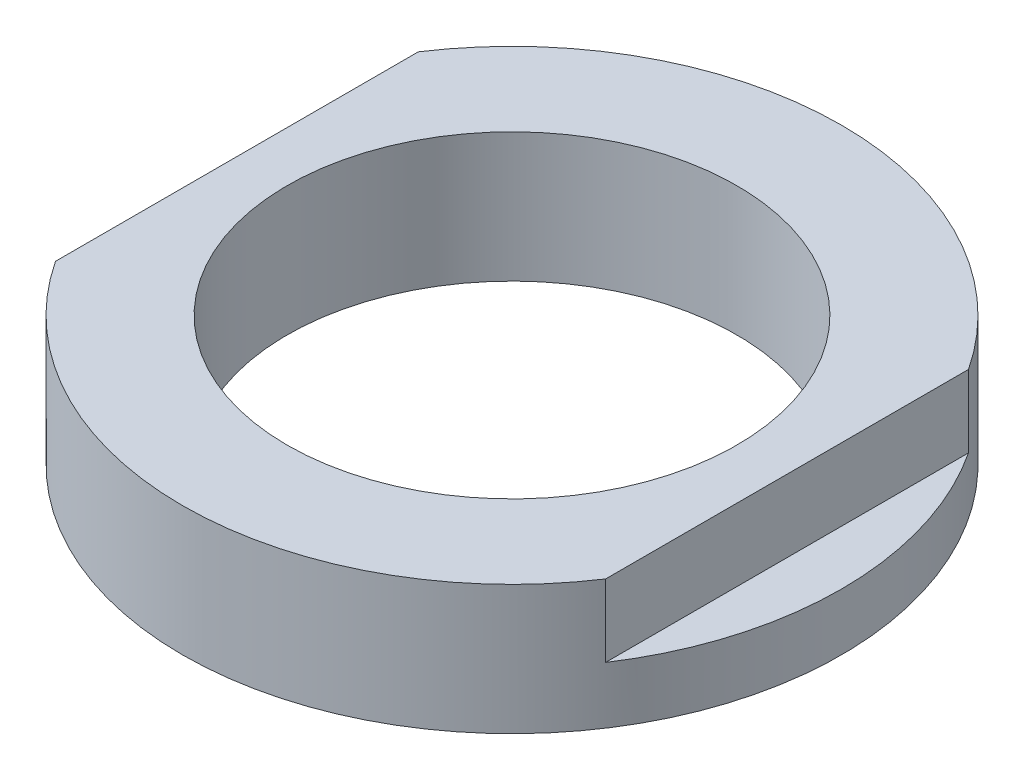
ISO-10303-21;
HEADER;
FILE_DESCRIPTION(('STEP AP214'),'2;1');
FILE_NAME('part.step','',(''),(''),'','','');
FILE_SCHEMA(('AUTOMOTIVE_DESIGN { 1 0 10303 214 1 1 1 1 }'));
ENDSEC;
DATA;
#1=APPLICATION_CONTEXT('core data for automotive mechanical design processes');
#2=APPLICATION_PROTOCOL_DEFINITION('international standard','automotive_design',2000,#1);
#3=PRODUCT_CONTEXT('',#1,'mechanical');
#4=PRODUCT('Part','Part','',(#3));
#5=PRODUCT_RELATED_PRODUCT_CATEGORY('part','',(#4));
#6=PRODUCT_DEFINITION_FORMATION('','',#4);
#7=PRODUCT_DEFINITION_CONTEXT('part definition',#1,'design');
#8=PRODUCT_DEFINITION('design','',#6,#7);
#9=PRODUCT_DEFINITION_SHAPE('','',#8);
#10=(LENGTH_UNIT() NAMED_UNIT(*) SI_UNIT(.MILLI.,.METRE.));
#11=(NAMED_UNIT(*) PLANE_ANGLE_UNIT() SI_UNIT($,.RADIAN.));
#12=(NAMED_UNIT(*) SI_UNIT($,.STERADIAN.) SOLID_ANGLE_UNIT());
#13=UNCERTAINTY_MEASURE_WITH_UNIT(LENGTH_MEASURE(1.E-05),#10,'distance_accuracy_value','');
#14=(GEOMETRIC_REPRESENTATION_CONTEXT(3) GLOBAL_UNCERTAINTY_ASSIGNED_CONTEXT((#13)) GLOBAL_UNIT_ASSIGNED_CONTEXT((#10,
#11,#12)) REPRESENTATION_CONTEXT('',''));
#15=CARTESIAN_POINT('',(0.,0.,0.));
#16=DIRECTION('',(0.,0.,1.));
#17=DIRECTION('',(1.,0.,0.));
#18=AXIS2_PLACEMENT_3D('',#15,#16,#17);
#19=CARTESIAN_POINT('',(0.,-2.794,0.));
#20=DIRECTION('',(0.,1.,0.));
#21=DIRECTION('',(0.,0.,1.));
#22=AXIS2_PLACEMENT_3D('',#19,#20,#21);
#23=PLANE('',#22);
#24=CARTESIAN_POINT('',(0.,-2.794,0.));
#25=DIRECTION('',(0.,1.,0.));
#26=DIRECTION('',(0.,0.,1.));
#27=AXIS2_PLACEMENT_3D('',#24,#25,#26);
#28=CIRCLE('',#27,14.24);
#29=CARTESIAN_POINT('',(0.,-2.794,14.24));
#30=VERTEX_POINT('',#29);
#31=EDGE_CURVE('E109',#30,#30,#28,.T.);
#32=ORIENTED_EDGE('',*,*,#31,.F.);
#33=EDGE_LOOP('',(#32));
#34=FACE_BOUND('',#33,.T.);
#35=CARTESIAN_POINT('',(0.,-2.794,0.));
#36=DIRECTION('',(0.,1.,0.));
#37=DIRECTION('',(0.,0.,1.));
#38=AXIS2_PLACEMENT_3D('',#35,#36,#37);
#39=CIRCLE('',#38,12.96365);
#40=CARTESIAN_POINT('',(0.,-2.794,12.96365));
#41=VERTEX_POINT('',#40);
#42=EDGE_CURVE('E11',#41,#41,#39,.F.);
#43=ORIENTED_EDGE('',*,*,#42,.F.);
#44=EDGE_LOOP('',(#43));
#45=FACE_BOUND('',#44,.T.);
#46=ADVANCED_FACE('F43',(#34,#45),#23,.F.);
#47=CARTESIAN_POINT('',(0.,-2.794,0.));
#48=DIRECTION('',(0.,1.,0.));
#49=DIRECTION('',(0.,0.,1.));
#50=AXIS2_PLACEMENT_3D('',#47,#48,#49);
#51=CIRCLE('',#50,9.7155);
#52=CARTESIAN_POINT('',(0.,-2.794,9.7155));
#53=VERTEX_POINT('',#52);
#54=EDGE_CURVE('E112',#53,#53,#51,.T.);
#55=ORIENTED_EDGE('',*,*,#54,.T.);
#56=EDGE_LOOP('',(#55));
#57=FACE_BOUND('',#56,.T.);
#58=CARTESIAN_POINT('',(0.,-2.794,0.));
#59=DIRECTION('',(0.,-1.,0.));
#60=DIRECTION('',(0.,0.,-1.));
#61=AXIS2_PLACEMENT_3D('',#58,#59,#60);
#62=CIRCLE('',#61,11.45235);
#63=CARTESIAN_POINT('',(0.,-2.794,-11.45235));
#64=VERTEX_POINT('',#63);
#65=EDGE_CURVE('E51',#64,#64,#62,.F.);
#66=ORIENTED_EDGE('',*,*,#65,.F.);
#67=EDGE_LOOP('',(#66));
#68=FACE_BOUND('',#67,.T.);
#69=ADVANCED_FACE('F128',(#57,#68),#23,.F.);
#70=CARTESIAN_POINT('',(0.,2.794,0.));
#71=DIRECTION('',(0.,1.,0.));
#72=DIRECTION('',(0.,0.,1.));
#73=AXIS2_PLACEMENT_3D('',#70,#71,#72);
#74=PLANE('',#73);
#75=CARTESIAN_POINT('',(0.,2.794,0.));
#76=DIRECTION('',(0.,1.,0.));
#77=DIRECTION('',(0.,0.,1.));
#78=AXIS2_PLACEMENT_3D('',#75,#76,#77);
#79=CIRCLE('',#78,9.7155);
#80=CARTESIAN_POINT('',(0.,2.794,9.7155));
#81=VERTEX_POINT('',#80);
#82=EDGE_CURVE('E115',#81,#81,#79,.T.);
#83=ORIENTED_EDGE('',*,*,#82,.F.);
#84=EDGE_LOOP('',(#83));
#85=FACE_BOUND('',#84,.T.);
#86=CARTESIAN_POINT('',(0.,2.794,0.));
#87=DIRECTION('',(0.,1.,0.));
#88=DIRECTION('',(0.,0.,1.));
#89=AXIS2_PLACEMENT_3D('',#86,#87,#88);
#90=CIRCLE('',#89,14.24);
#91=CARTESIAN_POINT('',(11.8872,2.794,-7.84041300952953));
#92=VERTEX_POINT('',#91);
#93=CARTESIAN_POINT('',(-11.8872,2.794,-7.84041300952953));
#94=VERTEX_POINT('',#93);
#95=EDGE_CURVE('E97',#92,#94,#90,.T.);
#96=ORIENTED_EDGE('',*,*,#95,.T.);
#97=DIRECTION('',(0.,0.,1.));
#98=VECTOR('',#97,1.);
#99=CARTESIAN_POINT('',(-11.8872,2.794,-10.5352539608494));
#100=LINE('',#99,#98);
#101=CARTESIAN_POINT('',(-11.8872,2.794,7.84041300952953));
#102=VERTEX_POINT('',#101);
#103=EDGE_CURVE('E83',#94,#102,#100,.T.);
#104=ORIENTED_EDGE('',*,*,#103,.T.);
#105=CARTESIAN_POINT('',(11.8872,2.794,7.84041300952953));
#106=VERTEX_POINT('',#105);
#107=EDGE_CURVE('E105',#102,#106,#90,.T.);
#108=ORIENTED_EDGE('',*,*,#107,.T.);
#109=DIRECTION('',(0.,0.,1.));
#110=VECTOR('',#109,1.);
#111=CARTESIAN_POINT('',(11.8872,2.794,-10.5352539608494));
#112=LINE('',#111,#110);
#113=EDGE_CURVE('E103',#92,#106,#112,.T.);
#114=ORIENTED_EDGE('',*,*,#113,.F.);
#115=EDGE_LOOP('',(#96,#104,#108,#114));
#116=FACE_BOUND('',#115,.T.);
#117=ADVANCED_FACE('F101',(#85,#116),#74,.T.);
#118=CARTESIAN_POINT('',(0.,2.794,0.));
#119=DIRECTION('',(0.,-1.,0.));
#120=DIRECTION('',(0.,0.,-1.));
#121=AXIS2_PLACEMENT_3D('',#118,#119,#120);
#122=CYLINDRICAL_SURFACE('',#121,14.24);
#123=ORIENTED_EDGE('',*,*,#31,.T.);
#124=EDGE_LOOP('',(#123));
#125=FACE_BOUND('',#124,.T.);
#126=DIRECTION('',(0.,-1.,0.));
#127=VECTOR('',#126,1.);
#128=CARTESIAN_POINT('',(-11.8872,2.794,-7.84041300952953));
#129=LINE('',#128,#127);
#130=CARTESIAN_POINT('',(-11.8872,-0.3302,-7.84041300952953));
#131=VERTEX_POINT('',#130);
#132=EDGE_CURVE('E86',#94,#131,#129,.T.);
#133=ORIENTED_EDGE('',*,*,#132,.F.);
#134=ORIENTED_EDGE('',*,*,#95,.F.);
#135=DIRECTION('',(0.,-1.,0.));
#136=VECTOR('',#135,1.);
#137=CARTESIAN_POINT('',(11.8872,2.794,-7.84041300952953));
#138=LINE('',#137,#136);
#139=CARTESIAN_POINT('',(11.8872,-0.3302,-7.84041300952953));
#140=VERTEX_POINT('',#139);
#141=EDGE_CURVE('E119',#92,#140,#138,.T.);
#142=ORIENTED_EDGE('',*,*,#141,.T.);
#143=CARTESIAN_POINT('',(0.,-0.3302,0.));
#144=DIRECTION('',(0.,1.,0.));
#145=DIRECTION('',(0.,0.,1.));
#146=AXIS2_PLACEMENT_3D('',#143,#144,#145);
#147=CIRCLE('',#146,14.24);
#148=CARTESIAN_POINT('',(11.8872,-0.3302,7.84041300952953));
#149=VERTEX_POINT('',#148);
#150=EDGE_CURVE('E104',#149,#140,#147,.T.);
#151=ORIENTED_EDGE('',*,*,#150,.F.);
#152=DIRECTION('',(0.,-1.,0.));
#153=VECTOR('',#152,1.);
#154=CARTESIAN_POINT('',(11.8872,2.794,7.84041300952953));
#155=LINE('',#154,#153);
#156=EDGE_CURVE('E107',#149,#106,#155,.F.);
#157=ORIENTED_EDGE('',*,*,#156,.T.);
#158=ORIENTED_EDGE('',*,*,#107,.F.);
#159=DIRECTION('',(0.,-1.,0.));
#160=VECTOR('',#159,1.);
#161=CARTESIAN_POINT('',(-11.8872,2.794,7.84041300952953));
#162=LINE('',#161,#160);
#163=CARTESIAN_POINT('',(-11.8872,-0.3302,7.84041300952953));
#164=VERTEX_POINT('',#163);
#165=EDGE_CURVE('E89',#164,#102,#162,.F.);
#166=ORIENTED_EDGE('',*,*,#165,.F.);
#167=CARTESIAN_POINT('',(0.,-0.3302,0.));
#168=DIRECTION('',(0.,1.,0.));
#169=DIRECTION('',(0.,0.,1.));
#170=AXIS2_PLACEMENT_3D('',#167,#168,#169);
#171=CIRCLE('',#170,14.24);
#172=EDGE_CURVE('E98',#131,#164,#171,.T.);
#173=ORIENTED_EDGE('',*,*,#172,.F.);
#174=EDGE_LOOP('',(#133,#134,#142,#151,#157,#158,#166,#173));
#175=FACE_BOUND('',#174,.T.);
#176=ADVANCED_FACE('F45',(#125,#175),#122,.T.);
#177=CARTESIAN_POINT('',(0.,2.794,0.));
#178=DIRECTION('',(0.,-1.,0.));
#179=DIRECTION('',(0.,0.,-1.));
#180=AXIS2_PLACEMENT_3D('',#177,#178,#179);
#181=CYLINDRICAL_SURFACE('',#180,9.7155);
#182=ORIENTED_EDGE('',*,*,#82,.T.);
#183=EDGE_LOOP('',(#182));
#184=FACE_BOUND('',#183,.T.);
#185=ORIENTED_EDGE('',*,*,#54,.F.);
#186=EDGE_LOOP('',(#185));
#187=FACE_BOUND('',#186,.T.);
#188=ADVANCED_FACE('F140',(#184,#187),#181,.F.);
#189=CARTESIAN_POINT('',(11.8872,-0.3302,-10.5352539608494));
#190=DIRECTION('',(-1.,0.,0.));
#191=DIRECTION('',(0.,0.,1.));
#192=AXIS2_PLACEMENT_3D('',#189,#190,#191);
#193=PLANE('',#192);
#194=ORIENTED_EDGE('',*,*,#113,.T.);
#195=ORIENTED_EDGE('',*,*,#156,.F.);
#196=DIRECTION('',(0.,0.,1.));
#197=VECTOR('',#196,1.);
#198=CARTESIAN_POINT('',(11.8872,-0.3302,-10.5352539608494));
#199=LINE('',#198,#197);
#200=EDGE_CURVE('E64',#140,#149,#199,.T.);
#201=ORIENTED_EDGE('',*,*,#200,.F.);
#202=ORIENTED_EDGE('',*,*,#141,.F.);
#203=EDGE_LOOP('',(#194,#195,#201,#202));
#204=FACE_BOUND('',#203,.T.);
#205=ADVANCED_FACE('F143',(#204),#193,.F.);
#206=CARTESIAN_POINT('',(11.8872,-0.3302,10.5352539608494));
#207=DIRECTION('',(0.,1.,0.));
#208=DIRECTION('',(0.,0.,1.));
#209=AXIS2_PLACEMENT_3D('',#206,#207,#208);
#210=PLANE('',#209);
#211=ORIENTED_EDGE('',*,*,#150,.T.);
#212=ORIENTED_EDGE('',*,*,#200,.T.);
#213=EDGE_LOOP('',(#211,#212));
#214=FACE_BOUND('',#213,.T.);
#215=ADVANCED_FACE('F147',(#214),#210,.T.);
#216=CARTESIAN_POINT('',(-11.8872,-0.3302,-10.5352539608494));
#217=DIRECTION('',(-1.,0.,0.));
#218=DIRECTION('',(0.,0.,1.));
#219=AXIS2_PLACEMENT_3D('',#216,#217,#218);
#220=PLANE('',#219);
#221=ORIENTED_EDGE('',*,*,#132,.T.);
#222=DIRECTION('',(0.,0.,1.));
#223=VECTOR('',#222,1.);
#224=CARTESIAN_POINT('',(-11.8872,-0.3302,-10.5352539608494));
#225=LINE('',#224,#223);
#226=EDGE_CURVE('E57',#131,#164,#225,.T.);
#227=ORIENTED_EDGE('',*,*,#226,.T.);
#228=ORIENTED_EDGE('',*,*,#165,.T.);
#229=ORIENTED_EDGE('',*,*,#103,.F.);
#230=EDGE_LOOP('',(#221,#227,#228,#229));
#231=FACE_BOUND('',#230,.T.);
#232=ADVANCED_FACE('F85',(#231),#220,.T.);
#233=CARTESIAN_POINT('',(-11.8872,-0.3302,10.5352539608494));
#234=DIRECTION('',(0.,1.,0.));
#235=DIRECTION('',(0.,0.,1.));
#236=AXIS2_PLACEMENT_3D('',#233,#234,#235);
#237=PLANE('',#236);
#238=ORIENTED_EDGE('',*,*,#172,.T.);
#239=ORIENTED_EDGE('',*,*,#226,.F.);
#240=EDGE_LOOP('',(#238,#239));
#241=FACE_BOUND('',#240,.T.);
#242=ADVANCED_FACE('F153',(#241),#237,.T.);
#243=CARTESIAN_POINT('',(0.,-2.794,0.));
#244=DIRECTION('',(0.,-1.,0.));
#245=DIRECTION('',(0.,0.,-1.));
#246=AXIS2_PLACEMENT_3D('',#243,#244,#245);
#247=TOROIDAL_SURFACE('',#246,12.208,0.75565);
#248=ORIENTED_EDGE('',*,*,#65,.T.);
#249=EDGE_LOOP('',(#248));
#250=FACE_BOUND('',#249,.T.);
#251=ORIENTED_EDGE('',*,*,#42,.T.);
#252=EDGE_LOOP('',(#251));
#253=FACE_BOUND('',#252,.T.);
#254=ADVANCED_FACE('F125',(#250,#253),#247,.T.);
#255=CLOSED_SHELL('',(#46,#69,#117,#176,#188,#205,#215,#232,#242,#254));
#256=MANIFOLD_SOLID_BREP('B2',#255);
#257=ADVANCED_BREP_SHAPE_REPRESENTATION('',(#18,#256),#14);
#258=SHAPE_DEFINITION_REPRESENTATION(#9,#257);
ENDSEC;
END-ISO-10303-21;
